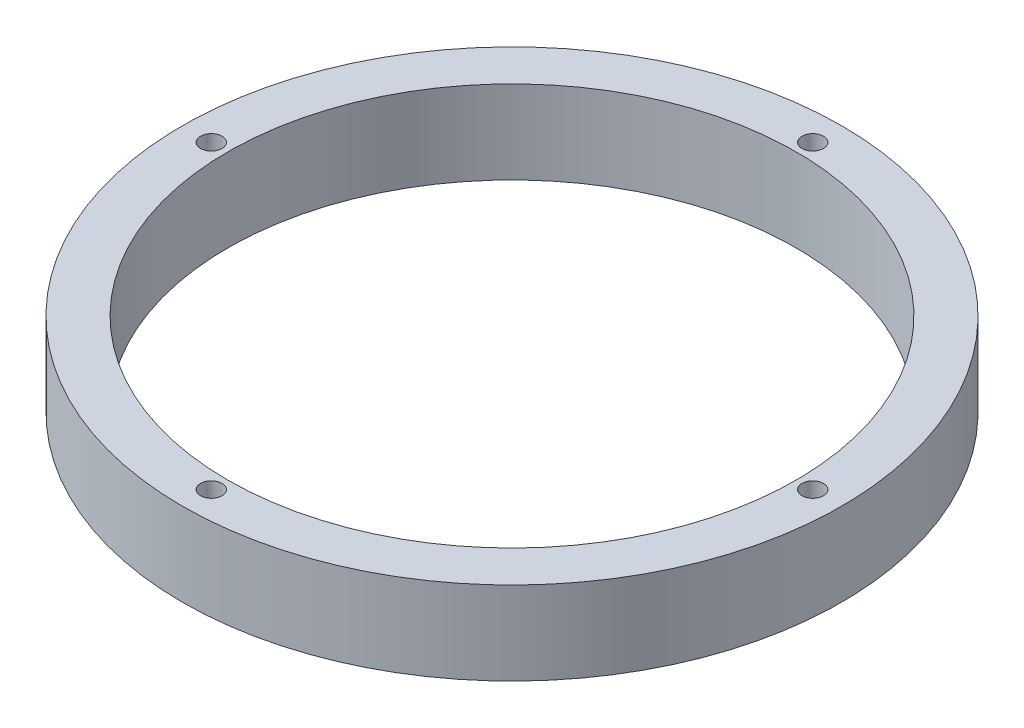
ISO-10303-21;
HEADER;
FILE_DESCRIPTION(('STEP AP214'),'2;1');
FILE_NAME('part.step','',(''),(''),'','','');
FILE_SCHEMA(('AUTOMOTIVE_DESIGN { 1 0 10303 214 1 1 1 1 }'));
ENDSEC;
DATA;
#1=APPLICATION_CONTEXT('core data for automotive mechanical design processes');
#2=APPLICATION_PROTOCOL_DEFINITION('international standard','automotive_design',2000,#1);
#3=PRODUCT_CONTEXT('',#1,'mechanical');
#4=PRODUCT('Part','Part','',(#3));
#5=PRODUCT_RELATED_PRODUCT_CATEGORY('part','',(#4));
#6=PRODUCT_DEFINITION_FORMATION('','',#4);
#7=PRODUCT_DEFINITION_CONTEXT('part definition',#1,'design');
#8=PRODUCT_DEFINITION('design','',#6,#7);
#9=PRODUCT_DEFINITION_SHAPE('','',#8);
#10=(LENGTH_UNIT() NAMED_UNIT(*) SI_UNIT(.MILLI.,.METRE.));
#11=(NAMED_UNIT(*) PLANE_ANGLE_UNIT() SI_UNIT($,.RADIAN.));
#12=(NAMED_UNIT(*) SI_UNIT($,.STERADIAN.) SOLID_ANGLE_UNIT());
#13=UNCERTAINTY_MEASURE_WITH_UNIT(LENGTH_MEASURE(1.E-05),#10,'distance_accuracy_value','');
#14=(GEOMETRIC_REPRESENTATION_CONTEXT(3) GLOBAL_UNCERTAINTY_ASSIGNED_CONTEXT((#13)) GLOBAL_UNIT_ASSIGNED_CONTEXT((#10,
#11,#12)) REPRESENTATION_CONTEXT('',''));
#15=CARTESIAN_POINT('',(0.,0.,0.));
#16=DIRECTION('',(0.,0.,1.));
#17=DIRECTION('',(1.,0.,0.));
#18=AXIS2_PLACEMENT_3D('',#15,#16,#17);
#19=CARTESIAN_POINT('',(0.,20.2,0.));
#20=DIRECTION('',(0.,1.,0.));
#21=DIRECTION('',(0.,0.,1.));
#22=AXIS2_PLACEMENT_3D('',#19,#20,#21);
#23=PLANE('',#22);
#24=CARTESIAN_POINT('',(-5.09756275471097E-13,20.2,73.));
#25=DIRECTION('',(0.,1.,0.));
#26=DIRECTION('',(0.,0.,1.));
#27=AXIS2_PLACEMENT_3D('',#24,#25,#26);
#28=CIRCLE('',#27,2.6);
#29=CARTESIAN_POINT('',(-5.09756275471097E-13,20.2,75.6));
#30=VERTEX_POINT('',#29);
#31=EDGE_CURVE('E76',#30,#30,#28,.T.);
#32=ORIENTED_EDGE('',*,*,#31,.F.);
#33=EDGE_LOOP('',(#32));
#34=FACE_BOUND('',#33,.T.);
#35=CARTESIAN_POINT('',(0.,20.2,0.));
#36=DIRECTION('',(0.,1.,0.));
#37=DIRECTION('',(0.,0.,1.));
#38=AXIS2_PLACEMENT_3D('',#35,#36,#37);
#39=CIRCLE('',#38,69.);
#40=CARTESIAN_POINT('',(0.,20.2,69.));
#41=VERTEX_POINT('',#40);
#42=EDGE_CURVE('E60',#41,#41,#39,.T.);
#43=ORIENTED_EDGE('',*,*,#42,.F.);
#44=EDGE_LOOP('',(#43));
#45=FACE_BOUND('',#44,.T.);
#46=CARTESIAN_POINT('',(0.,20.2,0.));
#47=DIRECTION('',(0.,1.,0.));
#48=DIRECTION('',(0.,0.,1.));
#49=AXIS2_PLACEMENT_3D('',#46,#47,#48);
#50=CIRCLE('',#49,80.);
#51=CARTESIAN_POINT('',(0.,20.2,80.));
#52=VERTEX_POINT('',#51);
#53=EDGE_CURVE('E10',#52,#52,#50,.T.);
#54=ORIENTED_EDGE('',*,*,#53,.T.);
#55=EDGE_LOOP('',(#54));
#56=FACE_BOUND('',#55,.T.);
#57=CARTESIAN_POINT('',(0.,20.2,-73.));
#58=DIRECTION('',(0.,1.,0.));
#59=DIRECTION('',(0.,0.,1.));
#60=AXIS2_PLACEMENT_3D('',#57,#58,#59);
#61=CIRCLE('',#60,2.6);
#62=CARTESIAN_POINT('',(0.,20.2,-70.4));
#63=VERTEX_POINT('',#62);
#64=EDGE_CURVE('E54',#63,#63,#61,.T.);
#65=ORIENTED_EDGE('',*,*,#64,.F.);
#66=EDGE_LOOP('',(#65));
#67=FACE_BOUND('',#66,.T.);
#68=CARTESIAN_POINT('',(73.,20.2,2.54878137735549E-13));
#69=DIRECTION('',(0.,1.,0.));
#70=DIRECTION('',(0.,0.,1.));
#71=AXIS2_PLACEMENT_3D('',#68,#69,#70);
#72=CIRCLE('',#71,2.6);
#73=CARTESIAN_POINT('',(73.,20.2,2.60000000000026));
#74=VERTEX_POINT('',#73);
#75=EDGE_CURVE('E68',#74,#74,#72,.T.);
#76=ORIENTED_EDGE('',*,*,#75,.F.);
#77=EDGE_LOOP('',(#76));
#78=FACE_BOUND('',#77,.T.);
#79=CARTESIAN_POINT('',(-73.,20.2,-7.64634413206646E-13));
#80=DIRECTION('',(0.,1.,0.));
#81=DIRECTION('',(0.,0.,1.));
#82=AXIS2_PLACEMENT_3D('',#79,#80,#81);
#83=CIRCLE('',#82,2.6);
#84=CARTESIAN_POINT('',(-73.,20.2,2.59999999999924));
#85=VERTEX_POINT('',#84);
#86=EDGE_CURVE('E84',#85,#85,#83,.T.);
#87=ORIENTED_EDGE('',*,*,#86,.F.);
#88=EDGE_LOOP('',(#87));
#89=FACE_BOUND('',#88,.T.);
#90=ADVANCED_FACE('F41',(#34,#45,#56,#67,#78,#89),#23,.T.);
#91=CARTESIAN_POINT('',(0.,0.,0.));
#92=DIRECTION('',(0.,1.,0.));
#93=DIRECTION('',(0.,0.,1.));
#94=AXIS2_PLACEMENT_3D('',#91,#92,#93);
#95=PLANE('',#94);
#96=CARTESIAN_POINT('',(0.,0.,0.));
#97=DIRECTION('',(0.,1.,0.));
#98=DIRECTION('',(0.,0.,1.));
#99=AXIS2_PLACEMENT_3D('',#96,#97,#98);
#100=CIRCLE('',#99,80.);
#101=CARTESIAN_POINT('',(0.,0.,80.));
#102=VERTEX_POINT('',#101);
#103=EDGE_CURVE('E45',#102,#102,#100,.T.);
#104=ORIENTED_EDGE('',*,*,#103,.F.);
#105=EDGE_LOOP('',(#104));
#106=FACE_BOUND('',#105,.T.);
#107=CARTESIAN_POINT('',(0.,0.,-73.));
#108=DIRECTION('',(0.,1.,0.));
#109=DIRECTION('',(0.,0.,1.));
#110=AXIS2_PLACEMENT_3D('',#107,#108,#109);
#111=CIRCLE('',#110,2.6);
#112=CARTESIAN_POINT('',(0.,0.,-70.4));
#113=VERTEX_POINT('',#112);
#114=EDGE_CURVE('E56',#113,#113,#111,.T.);
#115=ORIENTED_EDGE('',*,*,#114,.T.);
#116=EDGE_LOOP('',(#115));
#117=FACE_BOUND('',#116,.T.);
#118=CARTESIAN_POINT('',(0.,0.,0.));
#119=DIRECTION('',(0.,1.,0.));
#120=DIRECTION('',(0.,0.,1.));
#121=AXIS2_PLACEMENT_3D('',#118,#119,#120);
#122=CIRCLE('',#121,69.);
#123=CARTESIAN_POINT('',(0.,0.,69.));
#124=VERTEX_POINT('',#123);
#125=EDGE_CURVE('E64',#124,#124,#122,.T.);
#126=ORIENTED_EDGE('',*,*,#125,.T.);
#127=EDGE_LOOP('',(#126));
#128=FACE_BOUND('',#127,.T.);
#129=CARTESIAN_POINT('',(73.,0.,2.54878137735549E-13));
#130=DIRECTION('',(0.,1.,0.));
#131=DIRECTION('',(0.,0.,1.));
#132=AXIS2_PLACEMENT_3D('',#129,#130,#131);
#133=CIRCLE('',#132,2.6);
#134=CARTESIAN_POINT('',(73.,0.,2.60000000000026));
#135=VERTEX_POINT('',#134);
#136=EDGE_CURVE('E72',#135,#135,#133,.T.);
#137=ORIENTED_EDGE('',*,*,#136,.T.);
#138=EDGE_LOOP('',(#137));
#139=FACE_BOUND('',#138,.T.);
#140=CARTESIAN_POINT('',(-5.09756275471097E-13,0.,73.));
#141=DIRECTION('',(0.,1.,0.));
#142=DIRECTION('',(0.,0.,1.));
#143=AXIS2_PLACEMENT_3D('',#140,#141,#142);
#144=CIRCLE('',#143,2.6);
#145=CARTESIAN_POINT('',(-5.09756275471097E-13,0.,75.6));
#146=VERTEX_POINT('',#145);
#147=EDGE_CURVE('E80',#146,#146,#144,.T.);
#148=ORIENTED_EDGE('',*,*,#147,.T.);
#149=EDGE_LOOP('',(#148));
#150=FACE_BOUND('',#149,.T.);
#151=CARTESIAN_POINT('',(-73.,0.,-7.64634413206646E-13));
#152=DIRECTION('',(0.,1.,0.));
#153=DIRECTION('',(0.,0.,1.));
#154=AXIS2_PLACEMENT_3D('',#151,#152,#153);
#155=CIRCLE('',#154,2.6);
#156=CARTESIAN_POINT('',(-73.,0.,2.59999999999924));
#157=VERTEX_POINT('',#156);
#158=EDGE_CURVE('E88',#157,#157,#155,.T.);
#159=ORIENTED_EDGE('',*,*,#158,.T.);
#160=EDGE_LOOP('',(#159));
#161=FACE_BOUND('',#160,.T.);
#162=ADVANCED_FACE('F100',(#106,#117,#128,#139,#150,#161),#95,.F.);
#163=CARTESIAN_POINT('',(0.,20.2,0.));
#164=DIRECTION('',(0.,-1.,0.));
#165=DIRECTION('',(0.,0.,-1.));
#166=AXIS2_PLACEMENT_3D('',#163,#164,#165);
#167=CYLINDRICAL_SURFACE('',#166,80.);
#168=ORIENTED_EDGE('',*,*,#53,.F.);
#169=EDGE_LOOP('',(#168));
#170=FACE_BOUND('',#169,.T.);
#171=ORIENTED_EDGE('',*,*,#103,.T.);
#172=EDGE_LOOP('',(#171));
#173=FACE_BOUND('',#172,.T.);
#174=ADVANCED_FACE('F43',(#170,#173),#167,.T.);
#175=CARTESIAN_POINT('',(0.,20.2,-73.));
#176=DIRECTION('',(0.,-1.,0.));
#177=DIRECTION('',(0.,0.,-1.));
#178=AXIS2_PLACEMENT_3D('',#175,#176,#177);
#179=CYLINDRICAL_SURFACE('',#178,2.6);
#180=ORIENTED_EDGE('',*,*,#64,.T.);
#181=EDGE_LOOP('',(#180));
#182=FACE_BOUND('',#181,.T.);
#183=ORIENTED_EDGE('',*,*,#114,.F.);
#184=EDGE_LOOP('',(#183));
#185=FACE_BOUND('',#184,.T.);
#186=ADVANCED_FACE('F110',(#182,#185),#179,.F.);
#187=CARTESIAN_POINT('',(0.,20.2,0.));
#188=DIRECTION('',(0.,-1.,0.));
#189=DIRECTION('',(0.,0.,-1.));
#190=AXIS2_PLACEMENT_3D('',#187,#188,#189);
#191=CYLINDRICAL_SURFACE('',#190,69.);
#192=ORIENTED_EDGE('',*,*,#42,.T.);
#193=EDGE_LOOP('',(#192));
#194=FACE_BOUND('',#193,.T.);
#195=ORIENTED_EDGE('',*,*,#125,.F.);
#196=EDGE_LOOP('',(#195));
#197=FACE_BOUND('',#196,.T.);
#198=ADVANCED_FACE('F113',(#194,#197),#191,.F.);
#199=CARTESIAN_POINT('',(73.,20.2,2.54878137735549E-13));
#200=DIRECTION('',(0.,-1.,0.));
#201=DIRECTION('',(0.,0.,-1.));
#202=AXIS2_PLACEMENT_3D('',#199,#200,#201);
#203=CYLINDRICAL_SURFACE('',#202,2.6);
#204=ORIENTED_EDGE('',*,*,#75,.T.);
#205=EDGE_LOOP('',(#204));
#206=FACE_BOUND('',#205,.T.);
#207=ORIENTED_EDGE('',*,*,#136,.F.);
#208=EDGE_LOOP('',(#207));
#209=FACE_BOUND('',#208,.T.);
#210=ADVANCED_FACE('F117',(#206,#209),#203,.F.);
#211=CARTESIAN_POINT('',(-5.09756275471097E-13,20.2,73.));
#212=DIRECTION('',(0.,-1.,0.));
#213=DIRECTION('',(0.,0.,-1.));
#214=AXIS2_PLACEMENT_3D('',#211,#212,#213);
#215=CYLINDRICAL_SURFACE('',#214,2.6);
#216=ORIENTED_EDGE('',*,*,#31,.T.);
#217=EDGE_LOOP('',(#216));
#218=FACE_BOUND('',#217,.T.);
#219=ORIENTED_EDGE('',*,*,#147,.F.);
#220=EDGE_LOOP('',(#219));
#221=FACE_BOUND('',#220,.T.);
#222=ADVANCED_FACE('F121',(#218,#221),#215,.F.);
#223=CARTESIAN_POINT('',(-73.,20.2,-7.64634413206646E-13));
#224=DIRECTION('',(0.,-1.,0.));
#225=DIRECTION('',(0.,0.,-1.));
#226=AXIS2_PLACEMENT_3D('',#223,#224,#225);
#227=CYLINDRICAL_SURFACE('',#226,2.6);
#228=ORIENTED_EDGE('',*,*,#86,.T.);
#229=EDGE_LOOP('',(#228));
#230=FACE_BOUND('',#229,.T.);
#231=ORIENTED_EDGE('',*,*,#158,.F.);
#232=EDGE_LOOP('',(#231));
#233=FACE_BOUND('',#232,.T.);
#234=ADVANCED_FACE('F96',(#230,#233),#227,.F.);
#235=CLOSED_SHELL('',(#90,#162,#174,#186,#198,#210,#222,#234));
#236=MANIFOLD_SOLID_BREP('B2',#235);
#237=ADVANCED_BREP_SHAPE_REPRESENTATION('',(#18,#236),#14);
#238=SHAPE_DEFINITION_REPRESENTATION(#9,#237);
ENDSEC;
END-ISO-10303-21;
